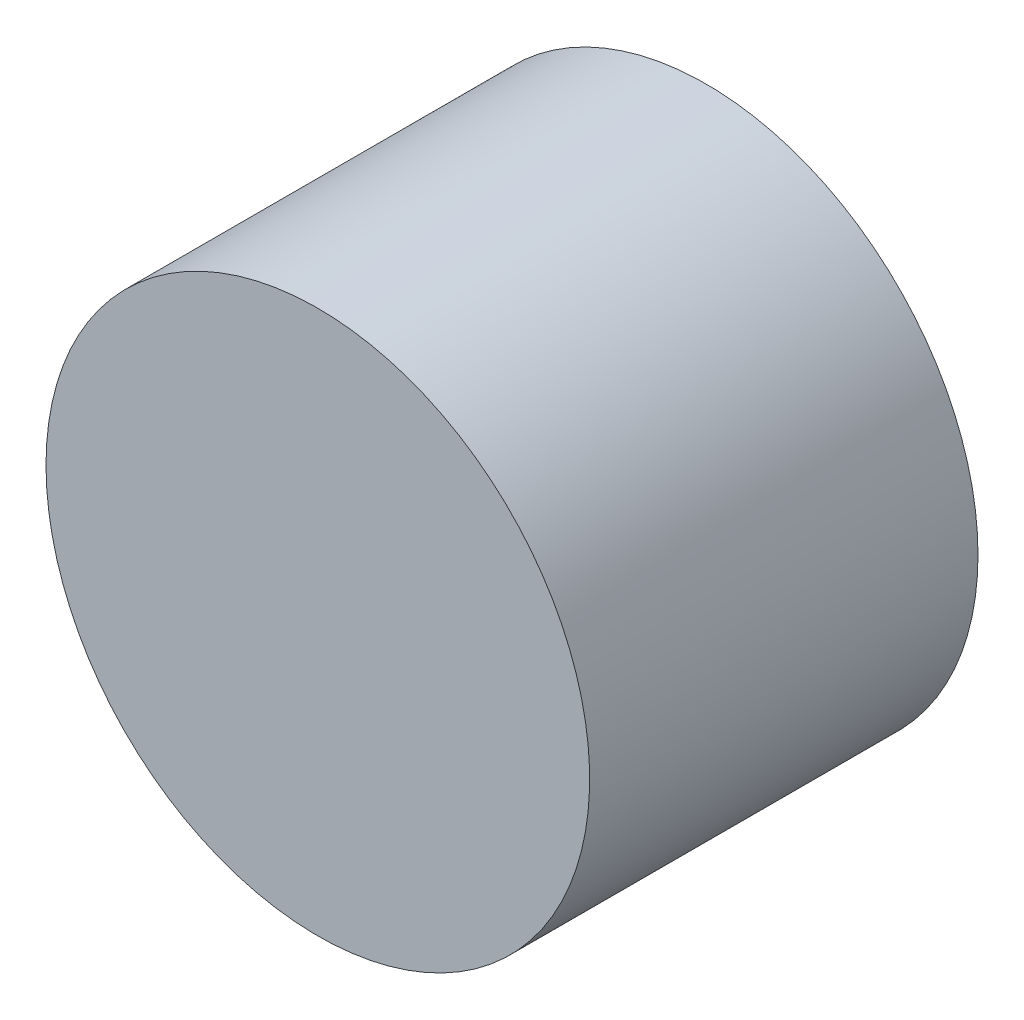
ISO-10303-21;
HEADER;
FILE_DESCRIPTION(('STEP AP214'),'2;1');
FILE_NAME('part.step','',(''),(''),'','','');
FILE_SCHEMA(('AUTOMOTIVE_DESIGN { 1 0 10303 214 1 1 1 1 }'));
ENDSEC;
DATA;
#1=APPLICATION_CONTEXT('core data for automotive mechanical design processes');
#2=APPLICATION_PROTOCOL_DEFINITION('international standard','automotive_design',2000,#1);
#3=PRODUCT_CONTEXT('',#1,'mechanical');
#4=PRODUCT('Part','Part','',(#3));
#5=PRODUCT_RELATED_PRODUCT_CATEGORY('part','',(#4));
#6=PRODUCT_DEFINITION_FORMATION('','',#4);
#7=PRODUCT_DEFINITION_CONTEXT('part definition',#1,'design');
#8=PRODUCT_DEFINITION('design','',#6,#7);
#9=PRODUCT_DEFINITION_SHAPE('','',#8);
#10=(LENGTH_UNIT() NAMED_UNIT(*) SI_UNIT(.MILLI.,.METRE.));
#11=(NAMED_UNIT(*) PLANE_ANGLE_UNIT() SI_UNIT($,.RADIAN.));
#12=(NAMED_UNIT(*) SI_UNIT($,.STERADIAN.) SOLID_ANGLE_UNIT());
#13=UNCERTAINTY_MEASURE_WITH_UNIT(LENGTH_MEASURE(1.E-05),#10,'distance_accuracy_value','');
#14=(GEOMETRIC_REPRESENTATION_CONTEXT(3) GLOBAL_UNCERTAINTY_ASSIGNED_CONTEXT((#13)) GLOBAL_UNIT_ASSIGNED_CONTEXT((#10,
#11,#12)) REPRESENTATION_CONTEXT('',''));
#15=CARTESIAN_POINT('',(0.,0.,0.));
#16=DIRECTION('',(0.,0.,1.));
#17=DIRECTION('',(1.,0.,0.));
#18=AXIS2_PLACEMENT_3D('',#15,#16,#17);
#19=CARTESIAN_POINT('',(0.,-240.,0.));
#20=DIRECTION('',(0.,0.,1.));
#21=DIRECTION('',(1.,0.,0.));
#22=AXIS2_PLACEMENT_3D('',#19,#20,#21);
#23=PLANE('',#22);
#24=CARTESIAN_POINT('',(-20.,-230.,0.));
#25=DIRECTION('',(0.,0.,-1.));
#26=DIRECTION('',(-1.,0.,0.));
#27=AXIS2_PLACEMENT_3D('',#24,#25,#26);
#28=CIRCLE('',#27,5.);
#29=CARTESIAN_POINT('',(-25.,-230.,0.));
#30=VERTEX_POINT('',#29);
#31=EDGE_CURVE('E70',#30,#30,#28,.T.);
#32=ORIENTED_EDGE('',*,*,#31,.F.);
#33=EDGE_LOOP('',(#32));
#34=FACE_BOUND('',#33,.T.);
#35=CARTESIAN_POINT('',(20.,-230.,0.));
#36=DIRECTION('',(0.,0.,-1.));
#37=DIRECTION('',(-1.,0.,0.));
#38=AXIS2_PLACEMENT_3D('',#35,#36,#37);
#39=CIRCLE('',#38,5.);
#40=CARTESIAN_POINT('',(15.,-230.,0.));
#41=VERTEX_POINT('',#40);
#42=EDGE_CURVE('E69',#41,#41,#39,.T.);
#43=ORIENTED_EDGE('',*,*,#42,.F.);
#44=EDGE_LOOP('',(#43));
#45=FACE_BOUND('',#44,.T.);
#46=CARTESIAN_POINT('',(0.,-220.,0.));
#47=DIRECTION('',(0.,0.,-1.));
#48=DIRECTION('',(-1.,0.,0.));
#49=AXIS2_PLACEMENT_3D('',#46,#47,#48);
#50=CIRCLE('',#49,4.24999999999999);
#51=CARTESIAN_POINT('',(-4.24999999999999,-220.,0.));
#52=VERTEX_POINT('',#51);
#53=EDGE_CURVE('E80',#52,#52,#50,.T.);
#54=ORIENTED_EDGE('',*,*,#53,.F.);
#55=EDGE_LOOP('',(#54));
#56=FACE_BOUND('',#55,.T.);
#57=CARTESIAN_POINT('',(-17.3205080756887,-250.,0.));
#58=DIRECTION('',(0.,0.,-1.));
#59=DIRECTION('',(-1.,0.,0.));
#60=AXIS2_PLACEMENT_3D('',#57,#58,#59);
#61=CIRCLE('',#60,4.24999999999999);
#62=CARTESIAN_POINT('',(-21.5705080756887,-250.,0.));
#63=VERTEX_POINT('',#62);
#64=EDGE_CURVE('E86',#63,#63,#61,.T.);
#65=ORIENTED_EDGE('',*,*,#64,.F.);
#66=EDGE_LOOP('',(#65));
#67=FACE_BOUND('',#66,.T.);
#68=CARTESIAN_POINT('',(17.3205080756888,-250.,0.));
#69=DIRECTION('',(0.,0.,-1.));
#70=DIRECTION('',(-1.,0.,0.));
#71=AXIS2_PLACEMENT_3D('',#68,#69,#70);
#72=CIRCLE('',#71,4.24999999999999);
#73=CARTESIAN_POINT('',(13.0705080756888,-250.,0.));
#74=VERTEX_POINT('',#73);
#75=EDGE_CURVE('E92',#74,#74,#72,.T.);
#76=ORIENTED_EDGE('',*,*,#75,.F.);
#77=EDGE_LOOP('',(#76));
#78=FACE_BOUND('',#77,.T.);
#79=CARTESIAN_POINT('',(0.,-240.,0.));
#80=DIRECTION('',(0.,0.,1.));
#81=DIRECTION('',(1.,0.,0.));
#82=AXIS2_PLACEMENT_3D('',#79,#80,#81);
#83=CIRCLE('',#82,35.);
#84=CARTESIAN_POINT('',(35.,-240.,0.));
#85=VERTEX_POINT('',#84);
#86=EDGE_CURVE('E43',#85,#85,#83,.T.);
#87=ORIENTED_EDGE('',*,*,#86,.F.);
#88=EDGE_LOOP('',(#87));
#89=FACE_BOUND('',#88,.T.);
#90=ADVANCED_FACE('F35',(#34,#45,#56,#67,#78,#89),#23,.F.);
#91=CARTESIAN_POINT('',(0.,-240.,148.994949366117));
#92=DIRECTION('',(0.,0.,-1.));
#93=DIRECTION('',(-1.,0.,0.));
#94=AXIS2_PLACEMENT_3D('',#91,#92,#93);
#95=CYLINDRICAL_SURFACE('',#94,35.);
#96=CARTESIAN_POINT('',(0.,-240.,50.));
#97=DIRECTION('',(0.,0.,-1.));
#98=DIRECTION('',(-1.,0.,0.));
#99=AXIS2_PLACEMENT_3D('',#96,#97,#98);
#100=CIRCLE('',#99,35.);
#101=CARTESIAN_POINT('',(-35.,-240.,50.));
#102=VERTEX_POINT('',#101);
#103=EDGE_CURVE('E11',#102,#102,#100,.T.);
#104=ORIENTED_EDGE('',*,*,#103,.T.);
#105=EDGE_LOOP('',(#104));
#106=FACE_BOUND('',#105,.T.);
#107=ORIENTED_EDGE('',*,*,#86,.T.);
#108=EDGE_LOOP('',(#107));
#109=FACE_BOUND('',#108,.T.);
#110=ADVANCED_FACE('F37',(#106,#109),#95,.T.);
#111=CARTESIAN_POINT('',(0.,0.,50.));
#112=DIRECTION('',(0.,0.,-1.));
#113=DIRECTION('',(-1.,0.,0.));
#114=AXIS2_PLACEMENT_3D('',#111,#112,#113);
#115=PLANE('',#114);
#116=ORIENTED_EDGE('',*,*,#103,.F.);
#117=EDGE_LOOP('',(#116));
#118=FACE_BOUND('',#117,.T.);
#119=ADVANCED_FACE('F107',(#118),#115,.F.);
#120=CARTESIAN_POINT('',(17.3205080756888,-250.,27.5));
#121=DIRECTION('',(0.,0.,-1.));
#122=DIRECTION('',(-1.,0.,0.));
#123=AXIS2_PLACEMENT_3D('',#120,#121,#122);
#124=CONICAL_SURFACE('',#123,4.24999999999999,1.02974425867665);
#125=CARTESIAN_POINT('',(17.3205080756888,-250.,30.0536576308671));
#126=VERTEX_POINT('',#125);
#127=VERTEX_LOOP('',#126);
#128=FACE_BOUND('',#127,.T.);
#129=CARTESIAN_POINT('',(17.3205080756888,-250.,27.5));
#130=DIRECTION('',(0.,0.,-1.));
#131=DIRECTION('',(-1.,0.,0.));
#132=AXIS2_PLACEMENT_3D('',#129,#130,#131);
#133=CIRCLE('',#132,4.24999999999999);
#134=CARTESIAN_POINT('',(13.0705080756888,-250.,27.5));
#135=VERTEX_POINT('',#134);
#136=EDGE_CURVE('E95',#135,#135,#133,.T.);
#137=ORIENTED_EDGE('',*,*,#136,.T.);
#138=EDGE_LOOP('',(#137));
#139=FACE_BOUND('',#138,.T.);
#140=ADVANCED_FACE('F114',(#128,#139),#124,.F.);
#141=CARTESIAN_POINT('',(17.3205080756888,-250.,0.));
#142=DIRECTION('',(0.,0.,-1.));
#143=DIRECTION('',(-1.,0.,0.));
#144=AXIS2_PLACEMENT_3D('',#141,#142,#143);
#145=CYLINDRICAL_SURFACE('',#144,4.24999999999999);
#146=ORIENTED_EDGE('',*,*,#136,.F.);
#147=EDGE_LOOP('',(#146));
#148=FACE_BOUND('',#147,.T.);
#149=ORIENTED_EDGE('',*,*,#75,.T.);
#150=EDGE_LOOP('',(#149));
#151=FACE_BOUND('',#150,.T.);
#152=ADVANCED_FACE('F118',(#148,#151),#145,.F.);
#153=CARTESIAN_POINT('',(-17.3205080756887,-250.,27.5));
#154=DIRECTION('',(0.,0.,-1.));
#155=DIRECTION('',(-1.,0.,0.));
#156=AXIS2_PLACEMENT_3D('',#153,#154,#155);
#157=CONICAL_SURFACE('',#156,4.24999999999999,1.02974425867665);
#158=CARTESIAN_POINT('',(-17.3205080756887,-250.,30.0536576308671));
#159=VERTEX_POINT('',#158);
#160=VERTEX_LOOP('',#159);
#161=FACE_BOUND('',#160,.T.);
#162=CARTESIAN_POINT('',(-17.3205080756887,-250.,27.5));
#163=DIRECTION('',(0.,0.,-1.));
#164=DIRECTION('',(-1.,0.,0.));
#165=AXIS2_PLACEMENT_3D('',#162,#163,#164);
#166=CIRCLE('',#165,4.24999999999999);
#167=CARTESIAN_POINT('',(-21.5705080756887,-250.,27.5));
#168=VERTEX_POINT('',#167);
#169=EDGE_CURVE('E89',#168,#168,#166,.T.);
#170=ORIENTED_EDGE('',*,*,#169,.T.);
#171=EDGE_LOOP('',(#170));
#172=FACE_BOUND('',#171,.T.);
#173=ADVANCED_FACE('F121',(#161,#172),#157,.F.);
#174=CARTESIAN_POINT('',(-17.3205080756887,-250.,0.));
#175=DIRECTION('',(0.,0.,-1.));
#176=DIRECTION('',(-1.,0.,0.));
#177=AXIS2_PLACEMENT_3D('',#174,#175,#176);
#178=CYLINDRICAL_SURFACE('',#177,4.24999999999999);
#179=ORIENTED_EDGE('',*,*,#169,.F.);
#180=EDGE_LOOP('',(#179));
#181=FACE_BOUND('',#180,.T.);
#182=ORIENTED_EDGE('',*,*,#64,.T.);
#183=EDGE_LOOP('',(#182));
#184=FACE_BOUND('',#183,.T.);
#185=ADVANCED_FACE('F125',(#181,#184),#178,.F.);
#186=CARTESIAN_POINT('',(0.,-220.,27.5));
#187=DIRECTION('',(0.,0.,-1.));
#188=DIRECTION('',(-1.,0.,0.));
#189=AXIS2_PLACEMENT_3D('',#186,#187,#188);
#190=CONICAL_SURFACE('',#189,4.24999999999999,1.02974425867665);
#191=CARTESIAN_POINT('',(0.,-220.,30.0536576308671));
#192=VERTEX_POINT('',#191);
#193=VERTEX_LOOP('',#192);
#194=FACE_BOUND('',#193,.T.);
#195=CARTESIAN_POINT('',(0.,-220.,27.5));
#196=DIRECTION('',(0.,0.,-1.));
#197=DIRECTION('',(-1.,0.,0.));
#198=AXIS2_PLACEMENT_3D('',#195,#196,#197);
#199=CIRCLE('',#198,4.24999999999999);
#200=CARTESIAN_POINT('',(-4.24999999999999,-220.,27.5));
#201=VERTEX_POINT('',#200);
#202=EDGE_CURVE('E83',#201,#201,#199,.T.);
#203=ORIENTED_EDGE('',*,*,#202,.T.);
#204=EDGE_LOOP('',(#203));
#205=FACE_BOUND('',#204,.T.);
#206=ADVANCED_FACE('F128',(#194,#205),#190,.F.);
#207=CARTESIAN_POINT('',(0.,-220.,0.));
#208=DIRECTION('',(0.,0.,-1.));
#209=DIRECTION('',(-1.,0.,0.));
#210=AXIS2_PLACEMENT_3D('',#207,#208,#209);
#211=CYLINDRICAL_SURFACE('',#210,4.24999999999999);
#212=ORIENTED_EDGE('',*,*,#202,.F.);
#213=EDGE_LOOP('',(#212));
#214=FACE_BOUND('',#213,.T.);
#215=ORIENTED_EDGE('',*,*,#53,.T.);
#216=EDGE_LOOP('',(#215));
#217=FACE_BOUND('',#216,.T.);
#218=ADVANCED_FACE('F132',(#214,#217),#211,.F.);
#219=CARTESIAN_POINT('',(20.,-230.,27.5));
#220=DIRECTION('',(0.,0.,-1.));
#221=DIRECTION('',(-1.,0.,0.));
#222=AXIS2_PLACEMENT_3D('',#219,#220,#221);
#223=CONICAL_SURFACE('',#222,4.99999999999999,1.02974425867665);
#224=CARTESIAN_POINT('',(20.,-230.,30.5043030951378));
#225=VERTEX_POINT('',#224);
#226=VERTEX_LOOP('',#225);
#227=FACE_BOUND('',#226,.T.);
#228=CARTESIAN_POINT('',(20.,-230.,27.5));
#229=DIRECTION('',(0.,0.,-1.));
#230=DIRECTION('',(-1.,0.,0.));
#231=AXIS2_PLACEMENT_3D('',#228,#229,#230);
#232=CIRCLE('',#231,4.99999999999999);
#233=CARTESIAN_POINT('',(15.,-230.,27.5));
#234=VERTEX_POINT('',#233);
#235=EDGE_CURVE('E73',#234,#234,#232,.T.);
#236=ORIENTED_EDGE('',*,*,#235,.T.);
#237=EDGE_LOOP('',(#236));
#238=FACE_BOUND('',#237,.T.);
#239=ADVANCED_FACE('F136',(#227,#238),#223,.F.);
#240=CARTESIAN_POINT('',(20.,-230.,0.));
#241=DIRECTION('',(0.,0.,-1.));
#242=DIRECTION('',(-1.,0.,0.));
#243=AXIS2_PLACEMENT_3D('',#240,#241,#242);
#244=CYLINDRICAL_SURFACE('',#243,5.);
#245=ORIENTED_EDGE('',*,*,#235,.F.);
#246=EDGE_LOOP('',(#245));
#247=FACE_BOUND('',#246,.T.);
#248=ORIENTED_EDGE('',*,*,#42,.T.);
#249=EDGE_LOOP('',(#248));
#250=FACE_BOUND('',#249,.T.);
#251=ADVANCED_FACE('F63',(#247,#250),#244,.F.);
#252=CARTESIAN_POINT('',(-20.,-230.,27.5));
#253=DIRECTION('',(0.,0.,-1.));
#254=DIRECTION('',(-1.,0.,0.));
#255=AXIS2_PLACEMENT_3D('',#252,#253,#254);
#256=CONICAL_SURFACE('',#255,4.99999999999999,1.02974425867665);
#257=CARTESIAN_POINT('',(-20.,-230.,30.5043030951378));
#258=VERTEX_POINT('',#257);
#259=VERTEX_LOOP('',#258);
#260=FACE_BOUND('',#259,.T.);
#261=CARTESIAN_POINT('',(-20.,-230.,27.5));
#262=DIRECTION('',(0.,0.,-1.));
#263=DIRECTION('',(-1.,0.,0.));
#264=AXIS2_PLACEMENT_3D('',#261,#262,#263);
#265=CIRCLE('',#264,4.99999999999999);
#266=CARTESIAN_POINT('',(-25.,-230.,27.5));
#267=VERTEX_POINT('',#266);
#268=EDGE_CURVE('E67',#267,#267,#265,.T.);
#269=ORIENTED_EDGE('',*,*,#268,.T.);
#270=EDGE_LOOP('',(#269));
#271=FACE_BOUND('',#270,.T.);
#272=ADVANCED_FACE('F59',(#260,#271),#256,.F.);
#273=CARTESIAN_POINT('',(-20.,-230.,0.));
#274=DIRECTION('',(0.,0.,-1.));
#275=DIRECTION('',(-1.,0.,0.));
#276=AXIS2_PLACEMENT_3D('',#273,#274,#275);
#277=CYLINDRICAL_SURFACE('',#276,5.);
#278=ORIENTED_EDGE('',*,*,#268,.F.);
#279=EDGE_LOOP('',(#278));
#280=FACE_BOUND('',#279,.T.);
#281=ORIENTED_EDGE('',*,*,#31,.T.);
#282=EDGE_LOOP('',(#281));
#283=FACE_BOUND('',#282,.T.);
#284=ADVANCED_FACE('F62',(#280,#283),#277,.F.);
#285=CLOSED_SHELL('',(#90,#110,#119,#140,#152,#173,#185,#206,#218,#239,#251,#272,#284));
#286=MANIFOLD_SOLID_BREP('B2',#285);
#287=ADVANCED_BREP_SHAPE_REPRESENTATION('',(#18,#286),#14);
#288=SHAPE_DEFINITION_REPRESENTATION(#9,#287);
ENDSEC;
END-ISO-10303-21;
